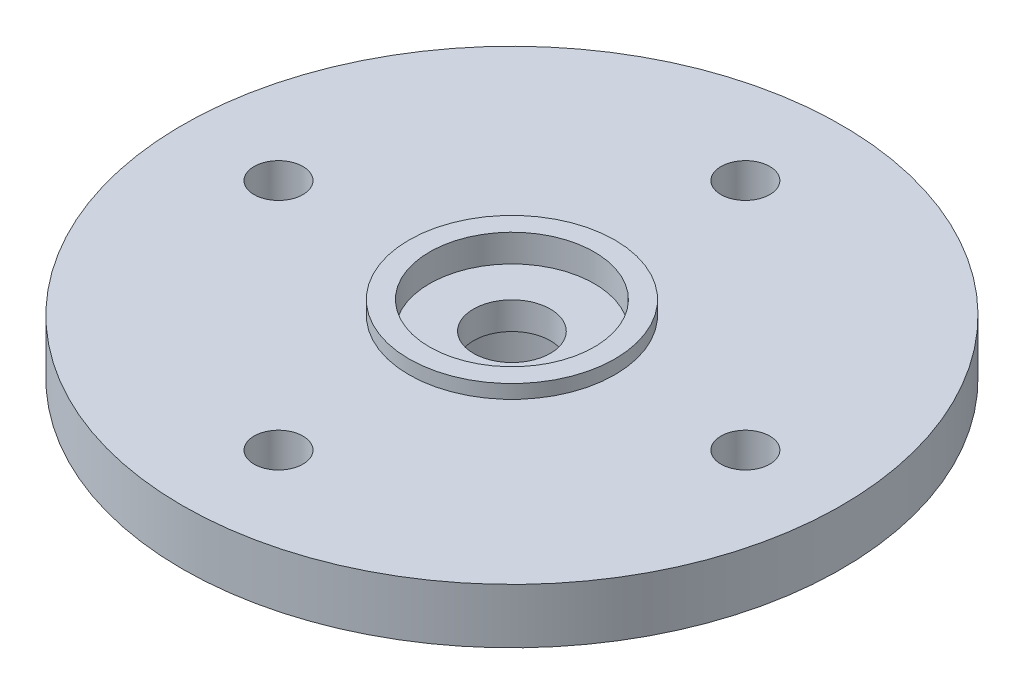
ISO-10303-21;
HEADER;
FILE_DESCRIPTION(('STEP AP214'),'2;1');
FILE_NAME('part.step','',(''),(''),'','','');
FILE_SCHEMA(('AUTOMOTIVE_DESIGN { 1 0 10303 214 1 1 1 1 }'));
ENDSEC;
DATA;
#1=APPLICATION_CONTEXT('core data for automotive mechanical design processes');
#2=APPLICATION_PROTOCOL_DEFINITION('international standard','automotive_design',2000,#1);
#3=PRODUCT_CONTEXT('',#1,'mechanical');
#4=PRODUCT('Part','Part','',(#3));
#5=PRODUCT_RELATED_PRODUCT_CATEGORY('part','',(#4));
#6=PRODUCT_DEFINITION_FORMATION('','',#4);
#7=PRODUCT_DEFINITION_CONTEXT('part definition',#1,'design');
#8=PRODUCT_DEFINITION('design','',#6,#7);
#9=PRODUCT_DEFINITION_SHAPE('','',#8);
#10=(LENGTH_UNIT() NAMED_UNIT(*) SI_UNIT(.MILLI.,.METRE.));
#11=(NAMED_UNIT(*) PLANE_ANGLE_UNIT() SI_UNIT($,.RADIAN.));
#12=(NAMED_UNIT(*) SI_UNIT($,.STERADIAN.) SOLID_ANGLE_UNIT());
#13=UNCERTAINTY_MEASURE_WITH_UNIT(LENGTH_MEASURE(1.E-05),#10,'distance_accuracy_value','');
#14=(GEOMETRIC_REPRESENTATION_CONTEXT(3) GLOBAL_UNCERTAINTY_ASSIGNED_CONTEXT((#13)) GLOBAL_UNIT_ASSIGNED_CONTEXT((#10,
#11,#12)) REPRESENTATION_CONTEXT('',''));
#15=CARTESIAN_POINT('',(0.,0.,0.));
#16=DIRECTION('',(0.,0.,1.));
#17=DIRECTION('',(1.,0.,0.));
#18=AXIS2_PLACEMENT_3D('',#15,#16,#17);
#19=CARTESIAN_POINT('',(0.,0.,0.));
#20=DIRECTION('',(0.,1.,0.));
#21=DIRECTION('',(0.,0.,1.));
#22=AXIS2_PLACEMENT_3D('',#19,#20,#21);
#23=CYLINDRICAL_SURFACE('',#22,1.4);
#24=CARTESIAN_POINT('',(0.,-0.5,0.));
#25=DIRECTION('',(0.,1.,0.));
#26=DIRECTION('',(0.,0.,1.));
#27=AXIS2_PLACEMENT_3D('',#24,#25,#26);
#28=CIRCLE('',#27,1.4);
#29=CARTESIAN_POINT('',(0.,-0.5,1.4));
#30=VERTEX_POINT('',#29);
#31=EDGE_CURVE('E47',#30,#30,#28,.T.);
#32=ORIENTED_EDGE('',*,*,#31,.T.);
#33=EDGE_LOOP('',(#32));
#34=FACE_BOUND('',#33,.T.);
#35=CARTESIAN_POINT('',(0.,-1.5,0.));
#36=DIRECTION('',(0.,-1.,0.));
#37=DIRECTION('',(0.,0.,-1.));
#38=AXIS2_PLACEMENT_3D('',#35,#36,#37);
#39=CIRCLE('',#38,1.4);
#40=CARTESIAN_POINT('',(0.,-1.5,-1.4));
#41=VERTEX_POINT('',#40);
#42=EDGE_CURVE('E35',#41,#41,#39,.T.);
#43=ORIENTED_EDGE('',*,*,#42,.T.);
#44=EDGE_LOOP('',(#43));
#45=FACE_BOUND('',#44,.T.);
#46=ADVANCED_FACE('F31',(#34,#45),#23,.F.);
#47=CARTESIAN_POINT('',(0.,0.,0.));
#48=DIRECTION('',(0.,1.,0.));
#49=DIRECTION('',(0.,0.,1.));
#50=AXIS2_PLACEMENT_3D('',#47,#48,#49);
#51=CYLINDRICAL_SURFACE('',#50,12.);
#52=CARTESIAN_POINT('',(0.,-2.,0.));
#53=DIRECTION('',(0.,1.,0.));
#54=DIRECTION('',(0.,0.,1.));
#55=AXIS2_PLACEMENT_3D('',#52,#53,#54);
#56=CIRCLE('',#55,12.);
#57=CARTESIAN_POINT('',(0.,-2.,12.));
#58=VERTEX_POINT('',#57);
#59=EDGE_CURVE('E10',#58,#58,#56,.T.);
#60=ORIENTED_EDGE('',*,*,#59,.T.);
#61=EDGE_LOOP('',(#60));
#62=FACE_BOUND('',#61,.T.);
#63=CARTESIAN_POINT('',(0.,0.,0.));
#64=DIRECTION('',(0.,1.,0.));
#65=DIRECTION('',(0.,0.,1.));
#66=AXIS2_PLACEMENT_3D('',#63,#64,#65);
#67=CIRCLE('',#66,12.);
#68=CARTESIAN_POINT('',(0.,0.,12.));
#69=VERTEX_POINT('',#68);
#70=EDGE_CURVE('E85',#69,#69,#67,.T.);
#71=ORIENTED_EDGE('',*,*,#70,.F.);
#72=EDGE_LOOP('',(#71));
#73=FACE_BOUND('',#72,.T.);
#74=ADVANCED_FACE('F33',(#62,#73),#51,.T.);
#75=CARTESIAN_POINT('',(-12.,-2.,0.));
#76=DIRECTION('',(0.,-1.,0.));
#77=DIRECTION('',(0.,0.,-1.));
#78=AXIS2_PLACEMENT_3D('',#75,#76,#77);
#79=PLANE('',#78);
#80=CARTESIAN_POINT('',(0.,-2.,-8.5));
#81=DIRECTION('',(0.,-1.,0.));
#82=DIRECTION('',(0.,0.,-1.));
#83=AXIS2_PLACEMENT_3D('',#80,#81,#82);
#84=CIRCLE('',#83,0.888999999999993);
#85=CARTESIAN_POINT('',(0.,-2.,-9.38899999999999));
#86=VERTEX_POINT('',#85);
#87=EDGE_CURVE('E54',#86,#86,#84,.T.);
#88=ORIENTED_EDGE('',*,*,#87,.F.);
#89=EDGE_LOOP('',(#88));
#90=FACE_BOUND('',#89,.T.);
#91=CARTESIAN_POINT('',(-8.5,-2.,0.));
#92=DIRECTION('',(0.,-1.,0.));
#93=DIRECTION('',(0.,0.,-1.));
#94=AXIS2_PLACEMENT_3D('',#91,#92,#93);
#95=CIRCLE('',#94,0.888999999999993);
#96=CARTESIAN_POINT('',(-8.5,-2.,-0.888999999999993));
#97=VERTEX_POINT('',#96);
#98=EDGE_CURVE('E70',#97,#97,#95,.T.);
#99=ORIENTED_EDGE('',*,*,#98,.F.);
#100=EDGE_LOOP('',(#99));
#101=FACE_BOUND('',#100,.T.);
#102=CARTESIAN_POINT('',(8.5,-2.,0.));
#103=DIRECTION('',(0.,-1.,0.));
#104=DIRECTION('',(0.,0.,-1.));
#105=AXIS2_PLACEMENT_3D('',#102,#103,#104);
#106=CIRCLE('',#105,0.888999999999993);
#107=CARTESIAN_POINT('',(8.5,-2.,-0.888999999999993));
#108=VERTEX_POINT('',#107);
#109=EDGE_CURVE('E76',#108,#108,#106,.T.);
#110=ORIENTED_EDGE('',*,*,#109,.F.);
#111=EDGE_LOOP('',(#110));
#112=FACE_BOUND('',#111,.T.);
#113=CARTESIAN_POINT('',(0.,-2.,8.5));
#114=DIRECTION('',(0.,-1.,0.));
#115=DIRECTION('',(0.,0.,-1.));
#116=AXIS2_PLACEMENT_3D('',#113,#114,#115);
#117=CIRCLE('',#116,0.888999999999993);
#118=CARTESIAN_POINT('',(0.,-2.,7.61100000000001));
#119=VERTEX_POINT('',#118);
#120=EDGE_CURVE('E82',#119,#119,#117,.T.);
#121=ORIENTED_EDGE('',*,*,#120,.F.);
#122=EDGE_LOOP('',(#121));
#123=FACE_BOUND('',#122,.T.);
#124=CARTESIAN_POINT('',(0.,-2.,0.));
#125=DIRECTION('',(0.,1.,0.));
#126=DIRECTION('',(0.,0.,1.));
#127=AXIS2_PLACEMENT_3D('',#124,#125,#126);
#128=CIRCLE('',#127,4.5);
#129=CARTESIAN_POINT('',(0.,-2.,4.5));
#130=VERTEX_POINT('',#129);
#131=EDGE_CURVE('E39',#130,#130,#128,.T.);
#132=ORIENTED_EDGE('',*,*,#131,.T.);
#133=EDGE_LOOP('',(#132));
#134=FACE_BOUND('',#133,.T.);
#135=ORIENTED_EDGE('',*,*,#59,.F.);
#136=EDGE_LOOP('',(#135));
#137=FACE_BOUND('',#136,.T.);
#138=ADVANCED_FACE('F111',(#90,#101,#112,#123,#134,#137),#79,.T.);
#139=CARTESIAN_POINT('',(0.,0.,0.));
#140=DIRECTION('',(0.,1.,0.));
#141=DIRECTION('',(0.,0.,1.));
#142=AXIS2_PLACEMENT_3D('',#139,#140,#141);
#143=CYLINDRICAL_SURFACE('',#142,4.5);
#144=CARTESIAN_POINT('',(0.,-4.5,0.));
#145=DIRECTION('',(0.,1.,0.));
#146=DIRECTION('',(0.,0.,1.));
#147=AXIS2_PLACEMENT_3D('',#144,#145,#146);
#148=CIRCLE('',#147,4.5);
#149=CARTESIAN_POINT('',(0.,-4.5,4.5));
#150=VERTEX_POINT('',#149);
#151=EDGE_CURVE('E44',#150,#150,#148,.T.);
#152=ORIENTED_EDGE('',*,*,#151,.T.);
#153=EDGE_LOOP('',(#152));
#154=FACE_BOUND('',#153,.T.);
#155=ORIENTED_EDGE('',*,*,#131,.F.);
#156=EDGE_LOOP('',(#155));
#157=FACE_BOUND('',#156,.T.);
#158=ADVANCED_FACE('F96',(#154,#157),#143,.T.);
#159=CARTESIAN_POINT('',(-4.5,-4.5,0.));
#160=DIRECTION('',(0.,-1.,0.));
#161=DIRECTION('',(0.,0.,-1.));
#162=AXIS2_PLACEMENT_3D('',#159,#160,#161);
#163=PLANE('',#162);
#164=CARTESIAN_POINT('',(0.,-4.5,0.));
#165=DIRECTION('',(0.,-1.,0.));
#166=DIRECTION('',(0.,0.,-1.));
#167=AXIS2_PLACEMENT_3D('',#164,#165,#166);
#168=CIRCLE('',#167,3.);
#169=CARTESIAN_POINT('',(0.,-4.5,-3.));
#170=VERTEX_POINT('',#169);
#171=EDGE_CURVE('E167',#170,#170,#168,.T.);
#172=ORIENTED_EDGE('',*,*,#171,.F.);
#173=EDGE_LOOP('',(#172));
#174=FACE_BOUND('',#173,.T.);
#175=ORIENTED_EDGE('',*,*,#151,.F.);
#176=EDGE_LOOP('',(#175));
#177=FACE_BOUND('',#176,.T.);
#178=ADVANCED_FACE('F99',(#174,#177),#163,.T.);
#179=CARTESIAN_POINT('',(-3.75,0.5,0.));
#180=DIRECTION('',(0.,1.,0.));
#181=DIRECTION('',(0.,0.,1.));
#182=AXIS2_PLACEMENT_3D('',#179,#180,#181);
#183=PLANE('',#182);
#184=CARTESIAN_POINT('',(0.,0.5,0.));
#185=DIRECTION('',(0.,1.,0.));
#186=DIRECTION('',(0.,0.,1.));
#187=AXIS2_PLACEMENT_3D('',#184,#185,#186);
#188=CIRCLE('',#187,3.);
#189=CARTESIAN_POINT('',(0.,0.5,3.));
#190=VERTEX_POINT('',#189);
#191=EDGE_CURVE('E57',#190,#190,#188,.T.);
#192=ORIENTED_EDGE('',*,*,#191,.F.);
#193=EDGE_LOOP('',(#192));
#194=FACE_BOUND('',#193,.T.);
#195=CARTESIAN_POINT('',(0.,0.5,0.));
#196=DIRECTION('',(0.,1.,0.));
#197=DIRECTION('',(0.,0.,1.));
#198=AXIS2_PLACEMENT_3D('',#195,#196,#197);
#199=CIRCLE('',#198,3.75);
#200=CARTESIAN_POINT('',(0.,0.5,3.75));
#201=VERTEX_POINT('',#200);
#202=EDGE_CURVE('E91',#201,#201,#199,.T.);
#203=ORIENTED_EDGE('',*,*,#202,.T.);
#204=EDGE_LOOP('',(#203));
#205=FACE_BOUND('',#204,.T.);
#206=ADVANCED_FACE('F101',(#194,#205),#183,.T.);
#207=CARTESIAN_POINT('',(0.,0.,0.));
#208=DIRECTION('',(0.,1.,0.));
#209=DIRECTION('',(0.,0.,1.));
#210=AXIS2_PLACEMENT_3D('',#207,#208,#209);
#211=CYLINDRICAL_SURFACE('',#210,3.75);
#212=CARTESIAN_POINT('',(0.,0.,0.));
#213=DIRECTION('',(0.,1.,0.));
#214=DIRECTION('',(0.,0.,1.));
#215=AXIS2_PLACEMENT_3D('',#212,#213,#214);
#216=CIRCLE('',#215,3.75);
#217=CARTESIAN_POINT('',(0.,0.,3.75));
#218=VERTEX_POINT('',#217);
#219=EDGE_CURVE('E88',#218,#218,#216,.T.);
#220=ORIENTED_EDGE('',*,*,#219,.T.);
#221=EDGE_LOOP('',(#220));
#222=FACE_BOUND('',#221,.T.);
#223=ORIENTED_EDGE('',*,*,#202,.F.);
#224=EDGE_LOOP('',(#223));
#225=FACE_BOUND('',#224,.T.);
#226=ADVANCED_FACE('F108',(#222,#225),#211,.T.);
#227=CARTESIAN_POINT('',(-12.,0.,0.));
#228=DIRECTION('',(0.,1.,0.));
#229=DIRECTION('',(0.,0.,1.));
#230=AXIS2_PLACEMENT_3D('',#227,#228,#229);
#231=PLANE('',#230);
#232=CARTESIAN_POINT('',(0.,0.,-8.5));
#233=DIRECTION('',(0.,1.,0.));
#234=DIRECTION('',(0.,0.,1.));
#235=AXIS2_PLACEMENT_3D('',#232,#233,#234);
#236=CIRCLE('',#235,0.888999999999987);
#237=CARTESIAN_POINT('',(0.,0.,-7.61100000000001));
#238=VERTEX_POINT('',#237);
#239=EDGE_CURVE('E49',#238,#238,#236,.T.);
#240=ORIENTED_EDGE('',*,*,#239,.F.);
#241=EDGE_LOOP('',(#240));
#242=FACE_BOUND('',#241,.T.);
#243=CARTESIAN_POINT('',(-8.5,0.,0.));
#244=DIRECTION('',(0.,1.,0.));
#245=DIRECTION('',(0.,0.,1.));
#246=AXIS2_PLACEMENT_3D('',#243,#244,#245);
#247=CIRCLE('',#246,0.888999999999987);
#248=CARTESIAN_POINT('',(-8.5,0.,0.888999999999987));
#249=VERTEX_POINT('',#248);
#250=EDGE_CURVE('E67',#249,#249,#247,.T.);
#251=ORIENTED_EDGE('',*,*,#250,.F.);
#252=EDGE_LOOP('',(#251));
#253=FACE_BOUND('',#252,.T.);
#254=CARTESIAN_POINT('',(8.5,0.,0.));
#255=DIRECTION('',(0.,1.,0.));
#256=DIRECTION('',(0.,0.,1.));
#257=AXIS2_PLACEMENT_3D('',#254,#255,#256);
#258=CIRCLE('',#257,0.888999999999987);
#259=CARTESIAN_POINT('',(8.5,0.,0.888999999999987));
#260=VERTEX_POINT('',#259);
#261=EDGE_CURVE('E73',#260,#260,#258,.T.);
#262=ORIENTED_EDGE('',*,*,#261,.F.);
#263=EDGE_LOOP('',(#262));
#264=FACE_BOUND('',#263,.T.);
#265=CARTESIAN_POINT('',(0.,0.,8.5));
#266=DIRECTION('',(0.,1.,0.));
#267=DIRECTION('',(0.,0.,1.));
#268=AXIS2_PLACEMENT_3D('',#265,#266,#267);
#269=CIRCLE('',#268,0.888999999999987);
#270=CARTESIAN_POINT('',(0.,0.,9.38899999999999));
#271=VERTEX_POINT('',#270);
#272=EDGE_CURVE('E79',#271,#271,#269,.T.);
#273=ORIENTED_EDGE('',*,*,#272,.F.);
#274=EDGE_LOOP('',(#273));
#275=FACE_BOUND('',#274,.T.);
#276=ORIENTED_EDGE('',*,*,#70,.T.);
#277=EDGE_LOOP('',(#276));
#278=FACE_BOUND('',#277,.T.);
#279=ORIENTED_EDGE('',*,*,#219,.F.);
#280=EDGE_LOOP('',(#279));
#281=FACE_BOUND('',#280,.T.);
#282=ADVANCED_FACE('F123',(#242,#253,#264,#275,#278,#281),#231,.T.);
#283=CARTESIAN_POINT('',(0.,0.,8.5));
#284=DIRECTION('',(0.,1.,0.));
#285=DIRECTION('',(0.,0.,1.));
#286=AXIS2_PLACEMENT_3D('',#283,#284,#285);
#287=CYLINDRICAL_SURFACE('',#286,0.888999999999993);
#288=ORIENTED_EDGE('',*,*,#272,.T.);
#289=EDGE_LOOP('',(#288));
#290=FACE_BOUND('',#289,.T.);
#291=ORIENTED_EDGE('',*,*,#120,.T.);
#292=EDGE_LOOP('',(#291));
#293=FACE_BOUND('',#292,.T.);
#294=ADVANCED_FACE('F127',(#290,#293),#287,.F.);
#295=CARTESIAN_POINT('',(8.5,0.,0.));
#296=DIRECTION('',(0.,1.,0.));
#297=DIRECTION('',(0.,0.,1.));
#298=AXIS2_PLACEMENT_3D('',#295,#296,#297);
#299=CYLINDRICAL_SURFACE('',#298,0.888999999999993);
#300=ORIENTED_EDGE('',*,*,#261,.T.);
#301=EDGE_LOOP('',(#300));
#302=FACE_BOUND('',#301,.T.);
#303=ORIENTED_EDGE('',*,*,#109,.T.);
#304=EDGE_LOOP('',(#303));
#305=FACE_BOUND('',#304,.T.);
#306=ADVANCED_FACE('F131',(#302,#305),#299,.F.);
#307=CARTESIAN_POINT('',(-8.5,0.,0.));
#308=DIRECTION('',(0.,1.,0.));
#309=DIRECTION('',(0.,0.,1.));
#310=AXIS2_PLACEMENT_3D('',#307,#308,#309);
#311=CYLINDRICAL_SURFACE('',#310,0.888999999999993);
#312=ORIENTED_EDGE('',*,*,#250,.T.);
#313=EDGE_LOOP('',(#312));
#314=FACE_BOUND('',#313,.T.);
#315=ORIENTED_EDGE('',*,*,#98,.T.);
#316=EDGE_LOOP('',(#315));
#317=FACE_BOUND('',#316,.T.);
#318=ADVANCED_FACE('F135',(#314,#317),#311,.F.);
#319=CARTESIAN_POINT('',(0.,0.,-8.5));
#320=DIRECTION('',(0.,1.,0.));
#321=DIRECTION('',(0.,0.,1.));
#322=AXIS2_PLACEMENT_3D('',#319,#320,#321);
#323=CYLINDRICAL_SURFACE('',#322,0.888999999999993);
#324=ORIENTED_EDGE('',*,*,#239,.T.);
#325=EDGE_LOOP('',(#324));
#326=FACE_BOUND('',#325,.T.);
#327=ORIENTED_EDGE('',*,*,#87,.T.);
#328=EDGE_LOOP('',(#327));
#329=FACE_BOUND('',#328,.T.);
#330=ADVANCED_FACE('F139',(#326,#329),#323,.F.);
#331=CARTESIAN_POINT('',(0.,-0.5,0.));
#332=DIRECTION('',(0.,1.,0.));
#333=DIRECTION('',(0.,0.,1.));
#334=AXIS2_PLACEMENT_3D('',#331,#332,#333);
#335=CYLINDRICAL_SURFACE('',#334,3.);
#336=CARTESIAN_POINT('',(0.,-0.5,0.));
#337=DIRECTION('',(0.,1.,0.));
#338=DIRECTION('',(0.,0.,1.));
#339=AXIS2_PLACEMENT_3D('',#336,#337,#338);
#340=CIRCLE('',#339,3.);
#341=CARTESIAN_POINT('',(0.,-0.5,3.));
#342=VERTEX_POINT('',#341);
#343=EDGE_CURVE('E50',#342,#342,#340,.T.);
#344=ORIENTED_EDGE('',*,*,#343,.F.);
#345=EDGE_LOOP('',(#344));
#346=FACE_BOUND('',#345,.T.);
#347=ORIENTED_EDGE('',*,*,#191,.T.);
#348=EDGE_LOOP('',(#347));
#349=FACE_BOUND('',#348,.T.);
#350=ADVANCED_FACE('F143',(#346,#349),#335,.F.);
#351=CARTESIAN_POINT('',(0.,-0.5,0.));
#352=DIRECTION('',(0.,1.,0.));
#353=DIRECTION('',(0.,0.,1.));
#354=AXIS2_PLACEMENT_3D('',#351,#352,#353);
#355=PLANE('',#354);
#356=ORIENTED_EDGE('',*,*,#31,.F.);
#357=EDGE_LOOP('',(#356));
#358=FACE_BOUND('',#357,.T.);
#359=ORIENTED_EDGE('',*,*,#343,.T.);
#360=EDGE_LOOP('',(#359));
#361=FACE_BOUND('',#360,.T.);
#362=ADVANCED_FACE('F147',(#358,#361),#355,.T.);
#363=CARTESIAN_POINT('',(0.,-1.5,0.));
#364=DIRECTION('',(0.,-1.,0.));
#365=DIRECTION('',(0.,0.,-1.));
#366=AXIS2_PLACEMENT_3D('',#363,#364,#365);
#367=CYLINDRICAL_SURFACE('',#366,3.);
#368=CARTESIAN_POINT('',(0.,-1.5,0.));
#369=DIRECTION('',(0.,-1.,0.));
#370=DIRECTION('',(0.,0.,-1.));
#371=AXIS2_PLACEMENT_3D('',#368,#369,#370);
#372=CIRCLE('',#371,3.);
#373=CARTESIAN_POINT('',(0.,-1.5,-3.));
#374=VERTEX_POINT('',#373);
#375=EDGE_CURVE('E166',#374,#374,#372,.T.);
#376=ORIENTED_EDGE('',*,*,#375,.F.);
#377=EDGE_LOOP('',(#376));
#378=FACE_BOUND('',#377,.T.);
#379=ORIENTED_EDGE('',*,*,#171,.T.);
#380=EDGE_LOOP('',(#379));
#381=FACE_BOUND('',#380,.T.);
#382=ADVANCED_FACE('F151',(#378,#381),#367,.F.);
#383=CARTESIAN_POINT('',(0.,-1.5,0.));
#384=DIRECTION('',(0.,-1.,0.));
#385=DIRECTION('',(0.,0.,-1.));
#386=AXIS2_PLACEMENT_3D('',#383,#384,#385);
#387=PLANE('',#386);
#388=ORIENTED_EDGE('',*,*,#42,.F.);
#389=EDGE_LOOP('',(#388));
#390=FACE_BOUND('',#389,.T.);
#391=ORIENTED_EDGE('',*,*,#375,.T.);
#392=EDGE_LOOP('',(#391));
#393=FACE_BOUND('',#392,.T.);
#394=ADVANCED_FACE('F155',(#390,#393),#387,.T.);
#395=CLOSED_SHELL('',(#46,#74,#138,#158,#178,#206,#226,#282,#294,#306,#318,#330,#350,#362,#382,#394));
#396=MANIFOLD_SOLID_BREP('B2',#395);
#397=ADVANCED_BREP_SHAPE_REPRESENTATION('',(#18,#396),#14);
#398=SHAPE_DEFINITION_REPRESENTATION(#9,#397);
ENDSEC;
END-ISO-10303-21;
